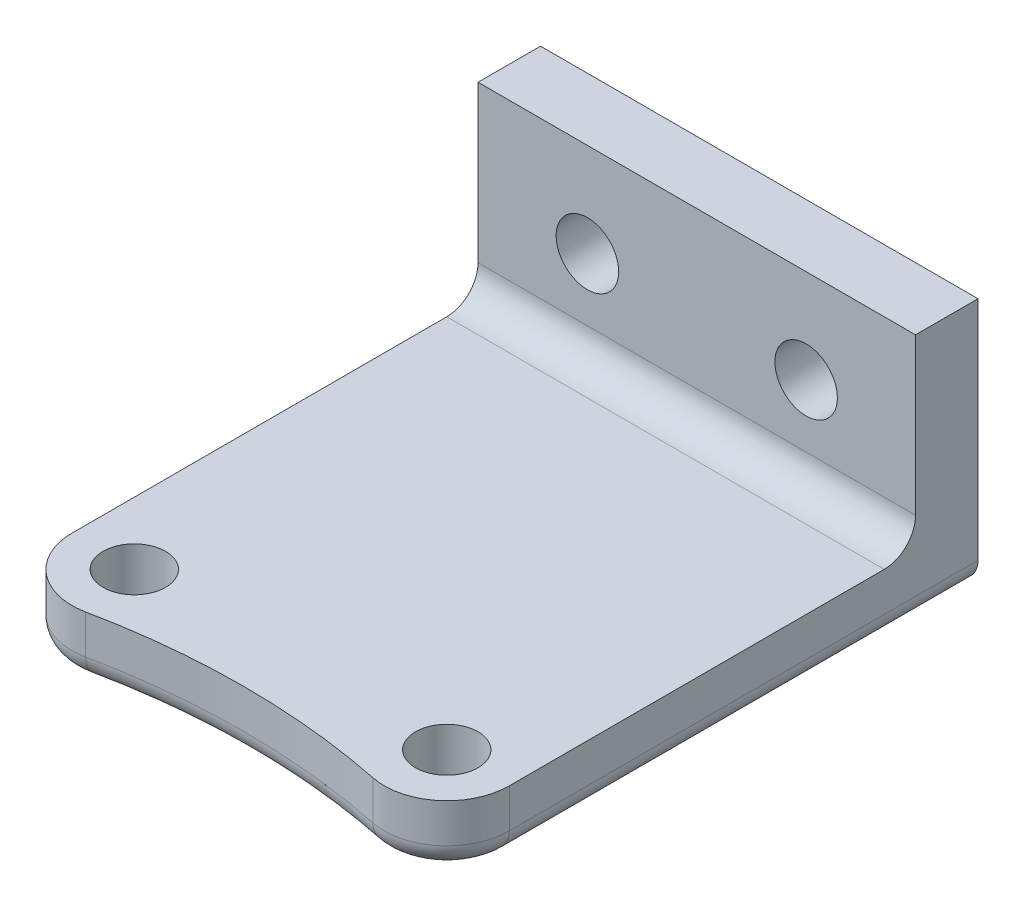
ISO-10303-21;
HEADER;
FILE_DESCRIPTION(('STEP AP214'),'2;1');
FILE_NAME('part.step','',(''),(''),'','','');
FILE_SCHEMA(('AUTOMOTIVE_DESIGN { 1 0 10303 214 1 1 1 1 }'));
ENDSEC;
DATA;
#1=APPLICATION_CONTEXT('core data for automotive mechanical design processes');
#2=APPLICATION_PROTOCOL_DEFINITION('international standard','automotive_design',2000,#1);
#3=PRODUCT_CONTEXT('',#1,'mechanical');
#4=PRODUCT('Part','Part','',(#3));
#5=PRODUCT_RELATED_PRODUCT_CATEGORY('part','',(#4));
#6=PRODUCT_DEFINITION_FORMATION('','',#4);
#7=PRODUCT_DEFINITION_CONTEXT('part definition',#1,'design');
#8=PRODUCT_DEFINITION('design','',#6,#7);
#9=PRODUCT_DEFINITION_SHAPE('','',#8);
#10=(LENGTH_UNIT() NAMED_UNIT(*) SI_UNIT(.MILLI.,.METRE.));
#11=(NAMED_UNIT(*) PLANE_ANGLE_UNIT() SI_UNIT($,.RADIAN.));
#12=(NAMED_UNIT(*) SI_UNIT($,.STERADIAN.) SOLID_ANGLE_UNIT());
#13=UNCERTAINTY_MEASURE_WITH_UNIT(LENGTH_MEASURE(1.E-05),#10,'distance_accuracy_value','');
#14=(GEOMETRIC_REPRESENTATION_CONTEXT(3) GLOBAL_UNCERTAINTY_ASSIGNED_CONTEXT((#13)) GLOBAL_UNIT_ASSIGNED_CONTEXT((#10,
#11,#12)) REPRESENTATION_CONTEXT('',''));
#15=CARTESIAN_POINT('',(0.,0.,0.));
#16=DIRECTION('',(0.,0.,1.));
#17=DIRECTION('',(1.,0.,0.));
#18=AXIS2_PLACEMENT_3D('',#15,#16,#17);
#19=CARTESIAN_POINT('',(10.,4.,48.7662963080753));
#20=DIRECTION('',(0.,1.,0.));
#21=DIRECTION('',(0.,0.,1.));
#22=AXIS2_PLACEMENT_3D('',#19,#20,#21);
#23=PLANE('',#22);
#24=DIRECTION('',(0.,0.,-1.));
#25=VECTOR('',#24,1.);
#26=CARTESIAN_POINT('',(24.,4.,-30.));
#27=LINE('',#26,#25);
#28=CARTESIAN_POINT('',(24.,4.,0.));
#29=VERTEX_POINT('',#28);
#30=CARTESIAN_POINT('',(24.,4.,-24.));
#31=VERTEX_POINT('',#30);
#32=EDGE_CURVE('E200',#29,#31,#27,.T.);
#33=ORIENTED_EDGE('',*,*,#32,.T.);
#34=DIRECTION('',(1.,0.,0.));
#35=VECTOR('',#34,1.);
#36=CARTESIAN_POINT('',(10.,4.,-24.));
#37=LINE('',#36,#35);
#38=CARTESIAN_POINT('',(-4.,4.,-24.));
#39=VERTEX_POINT('',#38);
#40=EDGE_CURVE('E60',#31,#39,#37,.F.);
#41=ORIENTED_EDGE('',*,*,#40,.T.);
#42=DIRECTION('',(0.,0.,1.));
#43=VECTOR('',#42,1.);
#44=CARTESIAN_POINT('',(-4.,4.,0.));
#45=LINE('',#44,#43);
#46=CARTESIAN_POINT('',(-4.,4.,0.));
#47=VERTEX_POINT('',#46);
#48=EDGE_CURVE('E203',#39,#47,#45,.T.);
#49=ORIENTED_EDGE('',*,*,#48,.T.);
#50=CARTESIAN_POINT('',(0.,4.,0.));
#51=DIRECTION('',(0.,1.,0.));
#52=DIRECTION('',(0.,0.,1.));
#53=AXIS2_PLACEMENT_3D('',#50,#51,#52);
#54=CIRCLE('',#53,4.);
#55=CARTESIAN_POINT('',(0.803518816065331,4.,3.91846366733558));
#56=VERTEX_POINT('',#55);
#57=EDGE_CURVE('E206',#47,#56,#54,.T.);
#58=ORIENTED_EDGE('',*,*,#57,.T.);
#59=CARTESIAN_POINT('',(10.,4.,48.7662963080753));
#60=DIRECTION('',(0.,-1.,0.));
#61=DIRECTION('',(0.,0.,1.));
#62=AXIS2_PLACEMENT_3D('',#59,#60,#61);
#63=CIRCLE('',#62,45.7810371085918);
#64=CARTESIAN_POINT('',(19.1964811839347,4.,3.91846366733558));
#65=VERTEX_POINT('',#64);
#66=EDGE_CURVE('E193',#56,#65,#63,.T.);
#67=ORIENTED_EDGE('',*,*,#66,.T.);
#68=CARTESIAN_POINT('',(20.,4.,0.));
#69=DIRECTION('',(0.,1.,0.));
#70=DIRECTION('',(0.,0.,1.));
#71=AXIS2_PLACEMENT_3D('',#68,#69,#70);
#72=CIRCLE('',#71,4.);
#73=EDGE_CURVE('E197',#65,#29,#72,.T.);
#74=ORIENTED_EDGE('',*,*,#73,.T.);
#75=EDGE_LOOP('',(#33,#41,#49,#58,#67,#74));
#76=FACE_BOUND('',#75,.T.);
#77=CARTESIAN_POINT('',(0.,4.,0.));
#78=DIRECTION('',(0.,1.,0.));
#79=DIRECTION('',(0.,0.,1.));
#80=AXIS2_PLACEMENT_3D('',#77,#78,#79);
#81=CIRCLE('',#80,2.);
#82=CARTESIAN_POINT('',(0.,4.,2.));
#83=VERTEX_POINT('',#82);
#84=EDGE_CURVE('E185',#83,#83,#81,.T.);
#85=ORIENTED_EDGE('',*,*,#84,.F.);
#86=EDGE_LOOP('',(#85));
#87=FACE_BOUND('',#86,.T.);
#88=CARTESIAN_POINT('',(20.,4.,0.));
#89=DIRECTION('',(0.,1.,0.));
#90=DIRECTION('',(0.,0.,1.));
#91=AXIS2_PLACEMENT_3D('',#88,#89,#90);
#92=CIRCLE('',#91,2.);
#93=CARTESIAN_POINT('',(20.,4.,2.));
#94=VERTEX_POINT('',#93);
#95=EDGE_CURVE('E177',#94,#94,#92,.T.);
#96=ORIENTED_EDGE('',*,*,#95,.F.);
#97=EDGE_LOOP('',(#96));
#98=FACE_BOUND('',#97,.T.);
#99=ADVANCED_FACE('F38',(#76,#87,#98),#23,.T.);
#100=CARTESIAN_POINT('',(10.,0.,48.7662963080753));
#101=DIRECTION('',(0.,1.,0.));
#102=DIRECTION('',(0.,0.,1.));
#103=AXIS2_PLACEMENT_3D('',#100,#101,#102);
#104=PLANE('',#103);
#105=DIRECTION('',(-1.,0.,0.));
#106=VECTOR('',#105,1.);
#107=CARTESIAN_POINT('',(-4.,0.,-30.));
#108=LINE('',#107,#106);
#109=CARTESIAN_POINT('',(22.5,0.,-30.));
#110=VERTEX_POINT('',#109);
#111=CARTESIAN_POINT('',(-2.5,0.,-30.));
#112=VERTEX_POINT('',#111);
#113=EDGE_CURVE('E189',#110,#112,#108,.T.);
#114=ORIENTED_EDGE('',*,*,#113,.F.);
#115=DIRECTION('',(0.,0.,-1.));
#116=VECTOR('',#115,1.);
#117=CARTESIAN_POINT('',(22.5,0.,48.7662963080753));
#118=LINE('',#117,#116);
#119=CARTESIAN_POINT('',(22.5,0.,0.));
#120=VERTEX_POINT('',#119);
#121=EDGE_CURVE('E249',#110,#120,#118,.F.);
#122=ORIENTED_EDGE('',*,*,#121,.T.);
#123=CARTESIAN_POINT('',(20.,0.,0.));
#124=DIRECTION('',(0.,1.,0.));
#125=DIRECTION('',(0.,0.,1.));
#126=AXIS2_PLACEMENT_3D('',#123,#124,#125);
#127=CIRCLE('',#126,2.5);
#128=CARTESIAN_POINT('',(19.4978007399592,0.,2.44903979208473));
#129=VERTEX_POINT('',#128);
#130=EDGE_CURVE('E246',#120,#129,#127,.F.);
#131=ORIENTED_EDGE('',*,*,#130,.T.);
#132=CARTESIAN_POINT('',(10.,0.,48.7662963080753));
#133=DIRECTION('',(0.,1.,0.));
#134=DIRECTION('',(0.,0.,1.));
#135=AXIS2_PLACEMENT_3D('',#132,#133,#134);
#136=CIRCLE('',#135,47.2810371085918);
#137=CARTESIAN_POINT('',(0.502199260040832,0.,2.44903979208473));
#138=VERTEX_POINT('',#137);
#139=EDGE_CURVE('E243',#129,#138,#136,.T.);
#140=ORIENTED_EDGE('',*,*,#139,.T.);
#141=CARTESIAN_POINT('',(0.,0.,0.));
#142=DIRECTION('',(0.,1.,0.));
#143=DIRECTION('',(0.,0.,1.));
#144=AXIS2_PLACEMENT_3D('',#141,#142,#143);
#145=CIRCLE('',#144,2.5);
#146=CARTESIAN_POINT('',(-2.5,0.,0.));
#147=VERTEX_POINT('',#146);
#148=EDGE_CURVE('E240',#138,#147,#145,.F.);
#149=ORIENTED_EDGE('',*,*,#148,.T.);
#150=DIRECTION('',(0.,0.,1.));
#151=VECTOR('',#150,1.);
#152=CARTESIAN_POINT('',(-2.5,0.,48.7662963080753));
#153=LINE('',#152,#151);
#154=EDGE_CURVE('E237',#147,#112,#153,.F.);
#155=ORIENTED_EDGE('',*,*,#154,.T.);
#156=EDGE_LOOP('',(#114,#122,#131,#140,#149,#155));
#157=FACE_BOUND('',#156,.T.);
#158=CARTESIAN_POINT('',(0.,0.,0.));
#159=DIRECTION('',(0.,1.,0.));
#160=DIRECTION('',(0.,0.,1.));
#161=AXIS2_PLACEMENT_3D('',#158,#159,#160);
#162=CIRCLE('',#161,2.);
#163=CARTESIAN_POINT('',(0.,0.,2.));
#164=VERTEX_POINT('',#163);
#165=EDGE_CURVE('E181',#164,#164,#162,.T.);
#166=ORIENTED_EDGE('',*,*,#165,.T.);
#167=EDGE_LOOP('',(#166));
#168=FACE_BOUND('',#167,.T.);
#169=CARTESIAN_POINT('',(20.,0.,0.));
#170=DIRECTION('',(0.,1.,0.));
#171=DIRECTION('',(0.,0.,1.));
#172=AXIS2_PLACEMENT_3D('',#169,#170,#171);
#173=CIRCLE('',#172,2.);
#174=CARTESIAN_POINT('',(20.,0.,2.));
#175=VERTEX_POINT('',#174);
#176=EDGE_CURVE('E176',#175,#175,#173,.T.);
#177=ORIENTED_EDGE('',*,*,#176,.T.);
#178=EDGE_LOOP('',(#177));
#179=FACE_BOUND('',#178,.T.);
#180=ADVANCED_FACE('F299',(#157,#168,#179),#104,.F.);
#181=CARTESIAN_POINT('',(10.,4.,48.7662963080753));
#182=DIRECTION('',(0.,-1.,0.));
#183=DIRECTION('',(0.,0.,-1.));
#184=AXIS2_PLACEMENT_3D('',#181,#182,#183);
#185=CYLINDRICAL_SURFACE('',#184,45.7810371085918);
#186=DIRECTION('',(0.,-1.,0.));
#187=VECTOR('',#186,1.);
#188=CARTESIAN_POINT('',(0.803518816065331,4.,3.91846366733558));
#189=LINE('',#188,#187);
#190=CARTESIAN_POINT('',(0.803518816065331,1.5,3.91846366733558));
#191=VERTEX_POINT('',#190);
#192=EDGE_CURVE('E209',#56,#191,#189,.T.);
#193=ORIENTED_EDGE('',*,*,#192,.T.);
#194=CARTESIAN_POINT('',(10.,1.5,48.7662963080753));
#195=DIRECTION('',(0.,1.,0.));
#196=DIRECTION('',(0.,0.,1.));
#197=AXIS2_PLACEMENT_3D('',#194,#195,#196);
#198=CIRCLE('',#197,45.7810371085918);
#199=CARTESIAN_POINT('',(19.1964811839347,1.5,3.91846366733558));
#200=VERTEX_POINT('',#199);
#201=EDGE_CURVE('E255',#191,#200,#198,.F.);
#202=ORIENTED_EDGE('',*,*,#201,.T.);
#203=DIRECTION('',(0.,-1.,0.));
#204=VECTOR('',#203,1.);
#205=CARTESIAN_POINT('',(19.1964811839347,4.,3.91846366733558));
#206=LINE('',#205,#204);
#207=EDGE_CURVE('E224',#65,#200,#206,.T.);
#208=ORIENTED_EDGE('',*,*,#207,.F.);
#209=ORIENTED_EDGE('',*,*,#66,.F.);
#210=EDGE_LOOP('',(#193,#202,#208,#209));
#211=FACE_BOUND('',#210,.T.);
#212=ADVANCED_FACE('F339',(#211),#185,.F.);
#213=CARTESIAN_POINT('',(20.,4.,0.));
#214=DIRECTION('',(0.,-1.,0.));
#215=DIRECTION('',(0.,0.,-1.));
#216=AXIS2_PLACEMENT_3D('',#213,#214,#215);
#217=CYLINDRICAL_SURFACE('',#216,4.);
#218=ORIENTED_EDGE('',*,*,#207,.T.);
#219=CARTESIAN_POINT('',(20.,1.5,0.));
#220=DIRECTION('',(0.,1.,0.));
#221=DIRECTION('',(0.,0.,1.));
#222=AXIS2_PLACEMENT_3D('',#219,#220,#221);
#223=CIRCLE('',#222,4.);
#224=CARTESIAN_POINT('',(24.,1.5,0.));
#225=VERTEX_POINT('',#224);
#226=EDGE_CURVE('E252',#200,#225,#223,.T.);
#227=ORIENTED_EDGE('',*,*,#226,.T.);
#228=DIRECTION('',(0.,-1.,0.));
#229=VECTOR('',#228,1.);
#230=CARTESIAN_POINT('',(24.,4.,0.));
#231=LINE('',#230,#229);
#232=EDGE_CURVE('E220',#29,#225,#231,.T.);
#233=ORIENTED_EDGE('',*,*,#232,.F.);
#234=ORIENTED_EDGE('',*,*,#73,.F.);
#235=EDGE_LOOP('',(#218,#227,#233,#234));
#236=FACE_BOUND('',#235,.T.);
#237=ADVANCED_FACE('F354',(#236),#217,.T.);
#238=CARTESIAN_POINT('',(24.,4.,-30.));
#239=DIRECTION('',(-1.,0.,0.));
#240=DIRECTION('',(0.,0.,1.));
#241=AXIS2_PLACEMENT_3D('',#238,#239,#240);
#242=PLANE('',#241);
#243=ORIENTED_EDGE('',*,*,#232,.T.);
#244=DIRECTION('',(0.,0.,-1.));
#245=VECTOR('',#244,1.);
#246=CARTESIAN_POINT('',(24.,1.5,-30.));
#247=LINE('',#246,#245);
#248=CARTESIAN_POINT('',(24.,1.5,-30.));
#249=VERTEX_POINT('',#248);
#250=EDGE_CURVE('E228',#225,#249,#247,.T.);
#251=ORIENTED_EDGE('',*,*,#250,.T.);
#252=DIRECTION('',(0.,-1.,0.));
#253=VECTOR('',#252,1.);
#254=CARTESIAN_POINT('',(24.,4.,-30.));
#255=LINE('',#254,#253);
#256=CARTESIAN_POINT('',(24.,16.,-30.));
#257=VERTEX_POINT('',#256);
#258=EDGE_CURVE('E139',#257,#249,#255,.T.);
#259=ORIENTED_EDGE('',*,*,#258,.F.);
#260=DIRECTION('',(0.,0.,-1.));
#261=VECTOR('',#260,1.);
#262=CARTESIAN_POINT('',(24.,16.,-26.));
#263=LINE('',#262,#261);
#264=CARTESIAN_POINT('',(24.,16.,-26.));
#265=VERTEX_POINT('',#264);
#266=EDGE_CURVE('E155',#265,#257,#263,.T.);
#267=ORIENTED_EDGE('',*,*,#266,.F.);
#268=DIRECTION('',(0.,-1.,0.));
#269=VECTOR('',#268,1.);
#270=CARTESIAN_POINT('',(24.,16.,-26.));
#271=LINE('',#270,#269);
#272=CARTESIAN_POINT('',(24.,6.,-26.));
#273=VERTEX_POINT('',#272);
#274=EDGE_CURVE('E171',#265,#273,#271,.T.);
#275=ORIENTED_EDGE('',*,*,#274,.T.);
#276=CARTESIAN_POINT('',(24.,6.,-24.));
#277=DIRECTION('',(-1.,0.,0.));
#278=DIRECTION('',(0.,0.,1.));
#279=AXIS2_PLACEMENT_3D('',#276,#277,#278);
#280=CIRCLE('',#279,2.);
#281=EDGE_CURVE('E47',#273,#31,#280,.T.);
#282=ORIENTED_EDGE('',*,*,#281,.T.);
#283=ORIENTED_EDGE('',*,*,#32,.F.);
#284=EDGE_LOOP('',(#243,#251,#259,#267,#275,#282,#283));
#285=FACE_BOUND('',#284,.T.);
#286=ADVANCED_FACE('F293',(#285),#242,.F.);
#287=CARTESIAN_POINT('',(-4.,4.,-30.));
#288=DIRECTION('',(0.,0.,1.));
#289=DIRECTION('',(1.,0.,0.));
#290=AXIS2_PLACEMENT_3D('',#287,#288,#289);
#291=PLANE('',#290);
#292=CARTESIAN_POINT('',(3.,10.,-30.));
#293=DIRECTION('',(0.,0.,1.));
#294=DIRECTION('',(1.,0.,0.));
#295=AXIS2_PLACEMENT_3D('',#292,#293,#294);
#296=CIRCLE('',#295,2.);
#297=CARTESIAN_POINT('',(5.,10.,-30.));
#298=VERTEX_POINT('',#297);
#299=EDGE_CURVE('E157',#298,#298,#296,.F.);
#300=ORIENTED_EDGE('',*,*,#299,.F.);
#301=EDGE_LOOP('',(#300));
#302=FACE_BOUND('',#301,.T.);
#303=CARTESIAN_POINT('',(17.,10.,-30.));
#304=DIRECTION('',(0.,0.,1.));
#305=DIRECTION('',(1.,0.,0.));
#306=AXIS2_PLACEMENT_3D('',#303,#304,#305);
#307=CIRCLE('',#306,2.);
#308=CARTESIAN_POINT('',(19.,10.,-30.));
#309=VERTEX_POINT('',#308);
#310=EDGE_CURVE('E164',#309,#309,#307,.F.);
#311=ORIENTED_EDGE('',*,*,#310,.F.);
#312=EDGE_LOOP('',(#311));
#313=FACE_BOUND('',#312,.T.);
#314=ORIENTED_EDGE('',*,*,#258,.T.);
#315=CARTESIAN_POINT('',(22.5,1.5,-30.));
#316=DIRECTION('',(0.,0.,1.));
#317=DIRECTION('',(1.,0.,0.));
#318=AXIS2_PLACEMENT_3D('',#315,#316,#317);
#319=CIRCLE('',#318,1.5);
#320=EDGE_CURVE('E234',#249,#110,#319,.F.);
#321=ORIENTED_EDGE('',*,*,#320,.T.);
#322=ORIENTED_EDGE('',*,*,#113,.T.);
#323=CARTESIAN_POINT('',(-2.5,1.5,-30.));
#324=DIRECTION('',(0.,0.,1.));
#325=DIRECTION('',(1.,0.,0.));
#326=AXIS2_PLACEMENT_3D('',#323,#324,#325);
#327=CIRCLE('',#326,1.5);
#328=CARTESIAN_POINT('',(-4.,1.5,-30.));
#329=VERTEX_POINT('',#328);
#330=EDGE_CURVE('E135',#112,#329,#327,.F.);
#331=ORIENTED_EDGE('',*,*,#330,.T.);
#332=DIRECTION('',(0.,-1.,0.));
#333=VECTOR('',#332,1.);
#334=CARTESIAN_POINT('',(-4.,4.,-30.));
#335=LINE('',#334,#333);
#336=CARTESIAN_POINT('',(-4.,16.,-30.));
#337=VERTEX_POINT('',#336);
#338=EDGE_CURVE('E127',#337,#329,#335,.T.);
#339=ORIENTED_EDGE('',*,*,#338,.F.);
#340=DIRECTION('',(-1.,0.,0.));
#341=VECTOR('',#340,1.);
#342=CARTESIAN_POINT('',(24.,16.,-30.));
#343=LINE('',#342,#341);
#344=EDGE_CURVE('E132',#257,#337,#343,.T.);
#345=ORIENTED_EDGE('',*,*,#344,.F.);
#346=EDGE_LOOP('',(#314,#321,#322,#331,#339,#345));
#347=FACE_BOUND('',#346,.T.);
#348=ADVANCED_FACE('F130',(#302,#313,#347),#291,.F.);
#349=CARTESIAN_POINT('',(-4.,4.,0.));
#350=DIRECTION('',(1.,0.,0.));
#351=DIRECTION('',(0.,0.,-1.));
#352=AXIS2_PLACEMENT_3D('',#349,#350,#351);
#353=PLANE('',#352);
#354=ORIENTED_EDGE('',*,*,#338,.T.);
#355=DIRECTION('',(0.,0.,1.));
#356=VECTOR('',#355,1.);
#357=CARTESIAN_POINT('',(-4.,1.5,0.));
#358=LINE('',#357,#356);
#359=CARTESIAN_POINT('',(-4.,1.5,0.));
#360=VERTEX_POINT('',#359);
#361=EDGE_CURVE('E261',#329,#360,#358,.T.);
#362=ORIENTED_EDGE('',*,*,#361,.T.);
#363=DIRECTION('',(0.,-1.,0.));
#364=VECTOR('',#363,1.);
#365=CARTESIAN_POINT('',(-4.,4.,0.));
#366=LINE('',#365,#364);
#367=EDGE_CURVE('E140',#47,#360,#366,.T.);
#368=ORIENTED_EDGE('',*,*,#367,.F.);
#369=ORIENTED_EDGE('',*,*,#48,.F.);
#370=CARTESIAN_POINT('',(-4.,6.,-24.));
#371=DIRECTION('',(1.,0.,0.));
#372=DIRECTION('',(0.,0.,-1.));
#373=AXIS2_PLACEMENT_3D('',#370,#371,#372);
#374=CIRCLE('',#373,2.);
#375=CARTESIAN_POINT('',(-4.,6.,-26.));
#376=VERTEX_POINT('',#375);
#377=EDGE_CURVE('E11',#39,#376,#374,.T.);
#378=ORIENTED_EDGE('',*,*,#377,.T.);
#379=DIRECTION('',(0.,-1.,0.));
#380=VECTOR('',#379,1.);
#381=CARTESIAN_POINT('',(-4.,16.,-26.));
#382=LINE('',#381,#380);
#383=CARTESIAN_POINT('',(-4.,16.,-26.));
#384=VERTEX_POINT('',#383);
#385=EDGE_CURVE('E146',#384,#376,#382,.T.);
#386=ORIENTED_EDGE('',*,*,#385,.F.);
#387=DIRECTION('',(0.,0.,1.));
#388=VECTOR('',#387,1.);
#389=CARTESIAN_POINT('',(-4.,16.,-30.));
#390=LINE('',#389,#388);
#391=EDGE_CURVE('E143',#337,#384,#390,.T.);
#392=ORIENTED_EDGE('',*,*,#391,.F.);
#393=EDGE_LOOP('',(#354,#362,#368,#369,#378,#386,#392));
#394=FACE_BOUND('',#393,.T.);
#395=ADVANCED_FACE('F144',(#394),#353,.F.);
#396=CARTESIAN_POINT('',(0.,4.,0.));
#397=DIRECTION('',(0.,-1.,0.));
#398=DIRECTION('',(0.,0.,-1.));
#399=AXIS2_PLACEMENT_3D('',#396,#397,#398);
#400=CYLINDRICAL_SURFACE('',#399,4.);
#401=ORIENTED_EDGE('',*,*,#367,.T.);
#402=CARTESIAN_POINT('',(0.,1.5,0.));
#403=DIRECTION('',(0.,1.,0.));
#404=DIRECTION('',(0.,0.,1.));
#405=AXIS2_PLACEMENT_3D('',#402,#403,#404);
#406=CIRCLE('',#405,4.);
#407=EDGE_CURVE('E258',#360,#191,#406,.T.);
#408=ORIENTED_EDGE('',*,*,#407,.T.);
#409=ORIENTED_EDGE('',*,*,#192,.F.);
#410=ORIENTED_EDGE('',*,*,#57,.F.);
#411=EDGE_LOOP('',(#401,#408,#409,#410));
#412=FACE_BOUND('',#411,.T.);
#413=ADVANCED_FACE('F324',(#412),#400,.T.);
#414=CARTESIAN_POINT('',(0.,4.,0.));
#415=DIRECTION('',(0.,-1.,0.));
#416=DIRECTION('',(0.,0.,-1.));
#417=AXIS2_PLACEMENT_3D('',#414,#415,#416);
#418=CYLINDRICAL_SURFACE('',#417,2.);
#419=ORIENTED_EDGE('',*,*,#84,.T.);
#420=EDGE_LOOP('',(#419));
#421=FACE_BOUND('',#420,.T.);
#422=ORIENTED_EDGE('',*,*,#165,.F.);
#423=EDGE_LOOP('',(#422));
#424=FACE_BOUND('',#423,.T.);
#425=ADVANCED_FACE('F342',(#421,#424),#418,.F.);
#426=CARTESIAN_POINT('',(20.,4.,0.));
#427=DIRECTION('',(0.,-1.,0.));
#428=DIRECTION('',(0.,0.,-1.));
#429=AXIS2_PLACEMENT_3D('',#426,#427,#428);
#430=CYLINDRICAL_SURFACE('',#429,2.);
#431=ORIENTED_EDGE('',*,*,#95,.T.);
#432=EDGE_LOOP('',(#431));
#433=FACE_BOUND('',#432,.T.);
#434=ORIENTED_EDGE('',*,*,#176,.F.);
#435=EDGE_LOOP('',(#434));
#436=FACE_BOUND('',#435,.T.);
#437=ADVANCED_FACE('F384',(#433,#436),#430,.F.);
#438=CARTESIAN_POINT('',(-4.,16.,-26.));
#439=DIRECTION('',(0.,0.,-1.));
#440=DIRECTION('',(-1.,0.,0.));
#441=AXIS2_PLACEMENT_3D('',#438,#439,#440);
#442=PLANE('',#441);
#443=CARTESIAN_POINT('',(3.,10.,-26.));
#444=DIRECTION('',(0.,0.,1.));
#445=DIRECTION('',(1.,0.,0.));
#446=AXIS2_PLACEMENT_3D('',#443,#444,#445);
#447=CIRCLE('',#446,2.);
#448=CARTESIAN_POINT('',(5.,10.,-26.));
#449=VERTEX_POINT('',#448);
#450=EDGE_CURVE('E161',#449,#449,#447,.T.);
#451=ORIENTED_EDGE('',*,*,#450,.F.);
#452=EDGE_LOOP('',(#451));
#453=FACE_BOUND('',#452,.T.);
#454=CARTESIAN_POINT('',(17.,10.,-26.));
#455=DIRECTION('',(0.,0.,1.));
#456=DIRECTION('',(1.,0.,0.));
#457=AXIS2_PLACEMENT_3D('',#454,#455,#456);
#458=CIRCLE('',#457,2.);
#459=CARTESIAN_POINT('',(19.,10.,-26.));
#460=VERTEX_POINT('',#459);
#461=EDGE_CURVE('E281',#460,#460,#458,.T.);
#462=ORIENTED_EDGE('',*,*,#461,.F.);
#463=EDGE_LOOP('',(#462));
#464=FACE_BOUND('',#463,.T.);
#465=ORIENTED_EDGE('',*,*,#385,.T.);
#466=DIRECTION('',(1.,0.,0.));
#467=VECTOR('',#466,1.);
#468=CARTESIAN_POINT('',(-4.,6.,-26.));
#469=LINE('',#468,#467);
#470=EDGE_CURVE('E264',#376,#273,#469,.T.);
#471=ORIENTED_EDGE('',*,*,#470,.T.);
#472=ORIENTED_EDGE('',*,*,#274,.F.);
#473=DIRECTION('',(1.,0.,0.));
#474=VECTOR('',#473,1.);
#475=CARTESIAN_POINT('',(-4.,16.,-26.));
#476=LINE('',#475,#474);
#477=EDGE_CURVE('E150',#384,#265,#476,.T.);
#478=ORIENTED_EDGE('',*,*,#477,.F.);
#479=EDGE_LOOP('',(#465,#471,#472,#478));
#480=FACE_BOUND('',#479,.T.);
#481=ADVANCED_FACE('F290',(#453,#464,#480),#442,.F.);
#482=CARTESIAN_POINT('',(0.,16.,0.));
#483=DIRECTION('',(0.,1.,0.));
#484=DIRECTION('',(0.,0.,1.));
#485=AXIS2_PLACEMENT_3D('',#482,#483,#484);
#486=PLANE('',#485);
#487=ORIENTED_EDGE('',*,*,#344,.T.);
#488=ORIENTED_EDGE('',*,*,#391,.T.);
#489=ORIENTED_EDGE('',*,*,#477,.T.);
#490=ORIENTED_EDGE('',*,*,#266,.T.);
#491=EDGE_LOOP('',(#487,#488,#489,#490));
#492=FACE_BOUND('',#491,.T.);
#493=ADVANCED_FACE('F153',(#492),#486,.T.);
#494=CARTESIAN_POINT('',(17.,10.,-35.6568542494924));
#495=DIRECTION('',(0.,0.,1.));
#496=DIRECTION('',(1.,0.,0.));
#497=AXIS2_PLACEMENT_3D('',#494,#495,#496);
#498=CYLINDRICAL_SURFACE('',#497,2.);
#499=ORIENTED_EDGE('',*,*,#310,.T.);
#500=EDGE_LOOP('',(#499));
#501=FACE_BOUND('',#500,.T.);
#502=ORIENTED_EDGE('',*,*,#461,.T.);
#503=EDGE_LOOP('',(#502));
#504=FACE_BOUND('',#503,.T.);
#505=ADVANCED_FACE('F371',(#501,#504),#498,.F.);
#506=CARTESIAN_POINT('',(3.,10.,-35.6568542494924));
#507=DIRECTION('',(0.,0.,1.));
#508=DIRECTION('',(1.,0.,0.));
#509=AXIS2_PLACEMENT_3D('',#506,#507,#508);
#510=CYLINDRICAL_SURFACE('',#509,2.);
#511=ORIENTED_EDGE('',*,*,#299,.T.);
#512=EDGE_LOOP('',(#511));
#513=FACE_BOUND('',#512,.T.);
#514=ORIENTED_EDGE('',*,*,#450,.T.);
#515=EDGE_LOOP('',(#514));
#516=FACE_BOUND('',#515,.T.);
#517=ADVANCED_FACE('F367',(#513,#516),#510,.F.);
#518=CARTESIAN_POINT('',(-2.5,1.5,0.));
#519=DIRECTION('',(0.,0.,1.));
#520=DIRECTION('',(1.,0.,0.));
#521=AXIS2_PLACEMENT_3D('',#518,#519,#520);
#522=CYLINDRICAL_SURFACE('',#521,1.5);
#523=ORIENTED_EDGE('',*,*,#330,.F.);
#524=ORIENTED_EDGE('',*,*,#154,.F.);
#525=CARTESIAN_POINT('',(-2.5,1.5,0.));
#526=DIRECTION('',(0.,0.,1.));
#527=DIRECTION('',(0.,-1.,0.));
#528=AXIS2_PLACEMENT_3D('',#525,#526,#527);
#529=CIRCLE('',#528,1.5);
#530=EDGE_CURVE('E277',#360,#147,#529,.T.);
#531=ORIENTED_EDGE('',*,*,#530,.F.);
#532=ORIENTED_EDGE('',*,*,#361,.F.);
#533=EDGE_LOOP('',(#523,#524,#531,#532));
#534=FACE_BOUND('',#533,.T.);
#535=ADVANCED_FACE('F320',(#534),#522,.T.);
#536=CARTESIAN_POINT('',(0.,1.5,0.));
#537=DIRECTION('',(0.,1.,0.));
#538=DIRECTION('',(0.,0.,1.));
#539=AXIS2_PLACEMENT_3D('',#536,#537,#538);
#540=TOROIDAL_SURFACE('',#539,2.5,1.5);
#541=ORIENTED_EDGE('',*,*,#530,.T.);
#542=ORIENTED_EDGE('',*,*,#148,.F.);
#543=CARTESIAN_POINT('',(0.502199260040832,1.5,2.44903979208473));
#544=DIRECTION('',(0.979615916833894,0.,-0.200879704016333));
#545=DIRECTION('',(-0.200879704016333,0.,-0.979615916833894));
#546=AXIS2_PLACEMENT_3D('',#543,#544,#545);
#547=CIRCLE('',#546,1.5);
#548=EDGE_CURVE('E273',#191,#138,#547,.T.);
#549=ORIENTED_EDGE('',*,*,#548,.F.);
#550=ORIENTED_EDGE('',*,*,#407,.F.);
#551=EDGE_LOOP('',(#541,#542,#549,#550));
#552=FACE_BOUND('',#551,.T.);
#553=ADVANCED_FACE('F317',(#552),#540,.T.);
#554=CARTESIAN_POINT('',(10.,1.5,48.7662963080753));
#555=DIRECTION('',(0.,1.,0.));
#556=DIRECTION('',(0.,0.,1.));
#557=AXIS2_PLACEMENT_3D('',#554,#555,#556);
#558=TOROIDAL_SURFACE('',#557,47.2810371085918,1.5);
#559=ORIENTED_EDGE('',*,*,#548,.T.);
#560=ORIENTED_EDGE('',*,*,#139,.F.);
#561=CARTESIAN_POINT('',(19.4978007399592,1.5,2.44903979208473));
#562=DIRECTION('',(0.979615916833894,0.,0.200879704016332));
#563=DIRECTION('',(0.200879704016332,0.,-0.979615916833894));
#564=AXIS2_PLACEMENT_3D('',#561,#562,#563);
#565=CIRCLE('',#564,1.5);
#566=EDGE_CURVE('E269',#200,#129,#565,.T.);
#567=ORIENTED_EDGE('',*,*,#566,.F.);
#568=ORIENTED_EDGE('',*,*,#201,.F.);
#569=EDGE_LOOP('',(#559,#560,#567,#568));
#570=FACE_BOUND('',#569,.T.);
#571=ADVANCED_FACE('F312',(#570),#558,.T.);
#572=CARTESIAN_POINT('',(20.,1.5,0.));
#573=DIRECTION('',(0.,1.,0.));
#574=DIRECTION('',(0.,0.,1.));
#575=AXIS2_PLACEMENT_3D('',#572,#573,#574);
#576=TOROIDAL_SURFACE('',#575,2.5,1.5);
#577=ORIENTED_EDGE('',*,*,#566,.T.);
#578=ORIENTED_EDGE('',*,*,#130,.F.);
#579=CARTESIAN_POINT('',(22.5,1.5,0.));
#580=DIRECTION('',(0.,0.,-1.));
#581=DIRECTION('',(-1.,0.,0.));
#582=AXIS2_PLACEMENT_3D('',#579,#580,#581);
#583=CIRCLE('',#582,1.5);
#584=EDGE_CURVE('E265',#225,#120,#583,.T.);
#585=ORIENTED_EDGE('',*,*,#584,.F.);
#586=ORIENTED_EDGE('',*,*,#226,.F.);
#587=EDGE_LOOP('',(#577,#578,#585,#586));
#588=FACE_BOUND('',#587,.T.);
#589=ADVANCED_FACE('F307',(#588),#576,.T.);
#590=CARTESIAN_POINT('',(22.5,1.5,-30.));
#591=DIRECTION('',(0.,0.,-1.));
#592=DIRECTION('',(-1.,0.,0.));
#593=AXIS2_PLACEMENT_3D('',#590,#591,#592);
#594=CYLINDRICAL_SURFACE('',#593,1.5);
#595=ORIENTED_EDGE('',*,*,#584,.T.);
#596=ORIENTED_EDGE('',*,*,#121,.F.);
#597=ORIENTED_EDGE('',*,*,#320,.F.);
#598=ORIENTED_EDGE('',*,*,#250,.F.);
#599=EDGE_LOOP('',(#595,#596,#597,#598));
#600=FACE_BOUND('',#599,.T.);
#601=ADVANCED_FACE('F303',(#600),#594,.T.);
#602=CARTESIAN_POINT('',(-4.,6.,-24.));
#603=DIRECTION('',(1.,0.,0.));
#604=DIRECTION('',(0.,0.,-1.));
#605=AXIS2_PLACEMENT_3D('',#602,#603,#604);
#606=CYLINDRICAL_SURFACE('',#605,2.);
#607=ORIENTED_EDGE('',*,*,#377,.F.);
#608=ORIENTED_EDGE('',*,*,#40,.F.);
#609=ORIENTED_EDGE('',*,*,#281,.F.);
#610=ORIENTED_EDGE('',*,*,#470,.F.);
#611=EDGE_LOOP('',(#607,#608,#609,#610));
#612=FACE_BOUND('',#611,.T.);
#613=ADVANCED_FACE('F40',(#612),#606,.F.);
#614=CLOSED_SHELL('',(#99,#180,#212,#237,#286,#348,#395,#413,#425,#437,#481,#493,#505,#517,#535,
#553,#571,#589,#601,#613));
#615=MANIFOLD_SOLID_BREP('B2',#614);
#616=ADVANCED_BREP_SHAPE_REPRESENTATION('',(#18,#615),#14);
#617=SHAPE_DEFINITION_REPRESENTATION(#9,#616);
ENDSEC;
END-ISO-10303-21;
